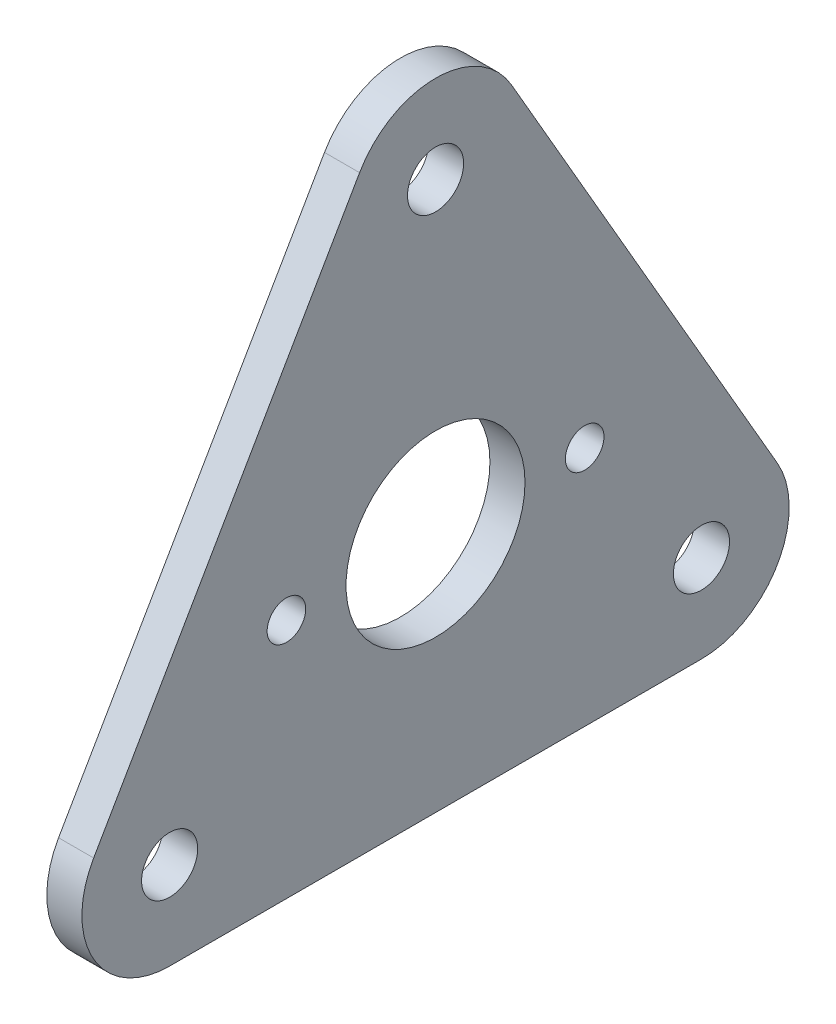
ISO-10303-21;
HEADER;
FILE_DESCRIPTION(('STEP AP214'),'2;1');
FILE_NAME('part.step','',(''),(''),'','','');
FILE_SCHEMA(('AUTOMOTIVE_DESIGN { 1 0 10303 214 1 1 1 1 }'));
ENDSEC;
DATA;
#1=APPLICATION_CONTEXT('core data for automotive mechanical design processes');
#2=APPLICATION_PROTOCOL_DEFINITION('international standard','automotive_design',2000,#1);
#3=PRODUCT_CONTEXT('',#1,'mechanical');
#4=PRODUCT('Part','Part','',(#3));
#5=PRODUCT_RELATED_PRODUCT_CATEGORY('part','',(#4));
#6=PRODUCT_DEFINITION_FORMATION('','',#4);
#7=PRODUCT_DEFINITION_CONTEXT('part definition',#1,'design');
#8=PRODUCT_DEFINITION('design','',#6,#7);
#9=PRODUCT_DEFINITION_SHAPE('','',#8);
#10=(LENGTH_UNIT() NAMED_UNIT(*) SI_UNIT(.MILLI.,.METRE.));
#11=(NAMED_UNIT(*) PLANE_ANGLE_UNIT() SI_UNIT($,.RADIAN.));
#12=(NAMED_UNIT(*) SI_UNIT($,.STERADIAN.) SOLID_ANGLE_UNIT());
#13=UNCERTAINTY_MEASURE_WITH_UNIT(LENGTH_MEASURE(1.E-05),#10,'distance_accuracy_value','');
#14=(GEOMETRIC_REPRESENTATION_CONTEXT(3) GLOBAL_UNCERTAINTY_ASSIGNED_CONTEXT((#13)) GLOBAL_UNIT_ASSIGNED_CONTEXT((#10,
#11,#12)) REPRESENTATION_CONTEXT('',''));
#15=CARTESIAN_POINT('',(0.,0.,0.));
#16=DIRECTION('',(0.,0.,1.));
#17=DIRECTION('',(1.,0.,0.));
#18=AXIS2_PLACEMENT_3D('',#15,#16,#17);
#19=CARTESIAN_POINT('',(2.,17.5,0.));
#20=DIRECTION('',(1.,0.,0.));
#21=DIRECTION('',(0.,0.,-1.));
#22=AXIS2_PLACEMENT_3D('',#19,#20,#21);
#23=PLANE('',#22);
#24=CARTESIAN_POINT('',(2.,-8.75,-15.1554445662277));
#25=DIRECTION('',(1.,0.,0.));
#26=DIRECTION('',(0.,0.,-1.));
#27=AXIS2_PLACEMENT_3D('',#24,#25,#26);
#28=CIRCLE('',#27,1.6);
#29=CARTESIAN_POINT('',(2.,-8.75,-16.7554445662277));
#30=VERTEX_POINT('',#29);
#31=EDGE_CURVE('E208',#30,#30,#28,.T.);
#32=ORIENTED_EDGE('',*,*,#31,.F.);
#33=EDGE_LOOP('',(#32));
#34=FACE_BOUND('',#33,.T.);
#35=CARTESIAN_POINT('',(2.,0.,8.5));
#36=DIRECTION('',(1.,0.,0.));
#37=DIRECTION('',(0.,0.,-1.));
#38=AXIS2_PLACEMENT_3D('',#35,#36,#37);
#39=CIRCLE('',#38,1.1);
#40=CARTESIAN_POINT('',(2.,0.,7.4));
#41=VERTEX_POINT('',#40);
#42=EDGE_CURVE('E141',#41,#41,#39,.T.);
#43=ORIENTED_EDGE('',*,*,#42,.F.);
#44=EDGE_LOOP('',(#43));
#45=FACE_BOUND('',#44,.T.);
#46=CARTESIAN_POINT('',(2.,0.,0.));
#47=DIRECTION('',(1.,0.,0.));
#48=DIRECTION('',(0.,0.,-1.));
#49=AXIS2_PLACEMENT_3D('',#46,#47,#48);
#50=CIRCLE('',#49,5.1);
#51=CARTESIAN_POINT('',(2.,0.,-5.1));
#52=VERTEX_POINT('',#51);
#53=EDGE_CURVE('E142',#52,#52,#50,.T.);
#54=ORIENTED_EDGE('',*,*,#53,.F.);
#55=EDGE_LOOP('',(#54));
#56=FACE_BOUND('',#55,.T.);
#57=CARTESIAN_POINT('',(2.,17.5,0.));
#58=DIRECTION('',(1.,0.,0.));
#59=DIRECTION('',(0.,0.,-1.));
#60=AXIS2_PLACEMENT_3D('',#57,#58,#59);
#61=CIRCLE('',#60,5.);
#62=CARTESIAN_POINT('',(2.,20.,-4.33012701892219));
#63=VERTEX_POINT('',#62);
#64=CARTESIAN_POINT('',(2.,20.,4.3301270189222));
#65=VERTEX_POINT('',#64);
#66=EDGE_CURVE('E154',#63,#65,#61,.T.);
#67=ORIENTED_EDGE('',*,*,#66,.T.);
#68=DIRECTION('',(0.,-0.866025403784439,0.5));
#69=VECTOR('',#68,1.);
#70=CARTESIAN_POINT('',(2.,20.,4.3301270189222));
#71=LINE('',#70,#69);
#72=CARTESIAN_POINT('',(2.,-6.25000000000001,19.4855715851499));
#73=VERTEX_POINT('',#72);
#74=EDGE_CURVE('E89',#65,#73,#71,.T.);
#75=ORIENTED_EDGE('',*,*,#74,.T.);
#76=CARTESIAN_POINT('',(2.,-8.75000000000001,15.1554445662277));
#77=DIRECTION('',(1.,0.,0.));
#78=DIRECTION('',(0.,0.,-1.));
#79=AXIS2_PLACEMENT_3D('',#76,#77,#78);
#80=CIRCLE('',#79,5.00000000000001);
#81=CARTESIAN_POINT('',(2.,-13.75,15.1554445662277));
#82=VERTEX_POINT('',#81);
#83=EDGE_CURVE('E102',#73,#82,#80,.T.);
#84=ORIENTED_EDGE('',*,*,#83,.T.);
#85=DIRECTION('',(0.,0.,-1.));
#86=VECTOR('',#85,1.);
#87=CARTESIAN_POINT('',(2.,-13.75,15.1554445662277));
#88=LINE('',#87,#86);
#89=CARTESIAN_POINT('',(2.,-13.75,-15.1554445662277));
#90=VERTEX_POINT('',#89);
#91=EDGE_CURVE('E96',#82,#90,#88,.T.);
#92=ORIENTED_EDGE('',*,*,#91,.T.);
#93=CARTESIAN_POINT('',(2.,-8.75,-15.1554445662277));
#94=DIRECTION('',(1.,0.,0.));
#95=DIRECTION('',(0.,0.,-1.));
#96=AXIS2_PLACEMENT_3D('',#93,#94,#95);
#97=CIRCLE('',#96,5.);
#98=CARTESIAN_POINT('',(2.,-6.25000000000001,-19.4855715851499));
#99=VERTEX_POINT('',#98);
#100=EDGE_CURVE('E100',#90,#99,#97,.T.);
#101=ORIENTED_EDGE('',*,*,#100,.T.);
#102=DIRECTION('',(0.,0.866025403784438,0.5));
#103=VECTOR('',#102,1.);
#104=CARTESIAN_POINT('',(2.,-6.25000000000001,-19.4855715851499));
#105=LINE('',#104,#103);
#106=EDGE_CURVE('E52',#99,#63,#105,.T.);
#107=ORIENTED_EDGE('',*,*,#106,.T.);
#108=EDGE_LOOP('',(#67,#75,#84,#92,#101,#107));
#109=FACE_BOUND('',#108,.T.);
#110=CARTESIAN_POINT('',(2.,17.5,0.));
#111=DIRECTION('',(1.,0.,0.));
#112=DIRECTION('',(0.,0.,-1.));
#113=AXIS2_PLACEMENT_3D('',#110,#111,#112);
#114=CIRCLE('',#113,1.6);
#115=CARTESIAN_POINT('',(2.,17.5,-1.6));
#116=VERTEX_POINT('',#115);
#117=EDGE_CURVE('E130',#116,#116,#114,.T.);
#118=ORIENTED_EDGE('',*,*,#117,.F.);
#119=EDGE_LOOP('',(#118));
#120=FACE_BOUND('',#119,.T.);
#121=CARTESIAN_POINT('',(2.,0.,-8.5));
#122=DIRECTION('',(1.,0.,0.));
#123=DIRECTION('',(0.,0.,1.));
#124=AXIS2_PLACEMENT_3D('',#121,#122,#123);
#125=CIRCLE('',#124,1.1);
#126=CARTESIAN_POINT('',(2.,0.,-7.4));
#127=VERTEX_POINT('',#126);
#128=EDGE_CURVE('E212',#127,#127,#125,.T.);
#129=ORIENTED_EDGE('',*,*,#128,.F.);
#130=EDGE_LOOP('',(#129));
#131=FACE_BOUND('',#130,.T.);
#132=CARTESIAN_POINT('',(2.,-8.75000000000001,15.1554445662277));
#133=DIRECTION('',(1.,0.,0.));
#134=DIRECTION('',(0.,0.,-1.));
#135=AXIS2_PLACEMENT_3D('',#132,#133,#134);
#136=CIRCLE('',#135,1.6);
#137=CARTESIAN_POINT('',(2.,-8.75000000000001,13.5554445662277));
#138=VERTEX_POINT('',#137);
#139=EDGE_CURVE('E203',#138,#138,#136,.T.);
#140=ORIENTED_EDGE('',*,*,#139,.F.);
#141=EDGE_LOOP('',(#140));
#142=FACE_BOUND('',#141,.T.);
#143=ADVANCED_FACE('F35',(#34,#45,#56,#109,#120,#131,#142),#23,.T.);
#144=CARTESIAN_POINT('',(0.,17.5,0.));
#145=DIRECTION('',(1.,0.,0.));
#146=DIRECTION('',(0.,0.,-1.));
#147=AXIS2_PLACEMENT_3D('',#144,#145,#146);
#148=PLANE('',#147);
#149=CARTESIAN_POINT('',(0.,17.5,0.));
#150=DIRECTION('',(1.,0.,0.));
#151=DIRECTION('',(0.,0.,-1.));
#152=AXIS2_PLACEMENT_3D('',#149,#150,#151);
#153=CIRCLE('',#152,5.);
#154=CARTESIAN_POINT('',(0.,20.,-4.33012701892219));
#155=VERTEX_POINT('',#154);
#156=CARTESIAN_POINT('',(0.,20.,4.3301270189222));
#157=VERTEX_POINT('',#156);
#158=EDGE_CURVE('E146',#155,#157,#153,.T.);
#159=ORIENTED_EDGE('',*,*,#158,.F.);
#160=DIRECTION('',(0.,0.866025403784438,0.5));
#161=VECTOR('',#160,1.);
#162=CARTESIAN_POINT('',(0.,-6.25000000000001,-19.4855715851499));
#163=LINE('',#162,#161);
#164=CARTESIAN_POINT('',(0.,-6.25000000000001,-19.4855715851499));
#165=VERTEX_POINT('',#164);
#166=EDGE_CURVE('E81',#165,#155,#163,.T.);
#167=ORIENTED_EDGE('',*,*,#166,.F.);
#168=CARTESIAN_POINT('',(0.,-8.75,-15.1554445662277));
#169=DIRECTION('',(1.,0.,0.));
#170=DIRECTION('',(0.,0.,-1.));
#171=AXIS2_PLACEMENT_3D('',#168,#169,#170);
#172=CIRCLE('',#171,5.);
#173=CARTESIAN_POINT('',(0.,-13.75,-15.1554445662277));
#174=VERTEX_POINT('',#173);
#175=EDGE_CURVE('E75',#174,#165,#172,.T.);
#176=ORIENTED_EDGE('',*,*,#175,.F.);
#177=DIRECTION('',(0.,0.,-1.));
#178=VECTOR('',#177,1.);
#179=CARTESIAN_POINT('',(0.,-13.75,15.1554445662277));
#180=LINE('',#179,#178);
#181=CARTESIAN_POINT('',(0.,-13.75,15.1554445662277));
#182=VERTEX_POINT('',#181);
#183=EDGE_CURVE('E110',#182,#174,#180,.T.);
#184=ORIENTED_EDGE('',*,*,#183,.F.);
#185=CARTESIAN_POINT('',(0.,-8.75000000000001,15.1554445662277));
#186=DIRECTION('',(1.,0.,0.));
#187=DIRECTION('',(0.,0.,-1.));
#188=AXIS2_PLACEMENT_3D('',#185,#186,#187);
#189=CIRCLE('',#188,5.00000000000001);
#190=CARTESIAN_POINT('',(0.,-6.25000000000001,19.4855715851499));
#191=VERTEX_POINT('',#190);
#192=EDGE_CURVE('E166',#191,#182,#189,.T.);
#193=ORIENTED_EDGE('',*,*,#192,.F.);
#194=DIRECTION('',(0.,-0.866025403784439,0.5));
#195=VECTOR('',#194,1.);
#196=CARTESIAN_POINT('',(0.,20.,4.3301270189222));
#197=LINE('',#196,#195);
#198=EDGE_CURVE('E162',#157,#191,#197,.T.);
#199=ORIENTED_EDGE('',*,*,#198,.F.);
#200=EDGE_LOOP('',(#159,#167,#176,#184,#193,#199));
#201=FACE_BOUND('',#200,.T.);
#202=CARTESIAN_POINT('',(0.,0.,0.));
#203=DIRECTION('',(1.,0.,0.));
#204=DIRECTION('',(0.,0.,-1.));
#205=AXIS2_PLACEMENT_3D('',#202,#203,#204);
#206=CIRCLE('',#205,5.1);
#207=CARTESIAN_POINT('',(0.,0.,-5.1));
#208=VERTEX_POINT('',#207);
#209=EDGE_CURVE('E135',#208,#208,#206,.T.);
#210=ORIENTED_EDGE('',*,*,#209,.T.);
#211=EDGE_LOOP('',(#210));
#212=FACE_BOUND('',#211,.T.);
#213=CARTESIAN_POINT('',(0.,17.5,0.));
#214=DIRECTION('',(1.,0.,0.));
#215=DIRECTION('',(0.,0.,-1.));
#216=AXIS2_PLACEMENT_3D('',#213,#214,#215);
#217=CIRCLE('',#216,1.6);
#218=CARTESIAN_POINT('',(0.,17.5,-1.6));
#219=VERTEX_POINT('',#218);
#220=EDGE_CURVE('E136',#219,#219,#217,.T.);
#221=ORIENTED_EDGE('',*,*,#220,.T.);
#222=EDGE_LOOP('',(#221));
#223=FACE_BOUND('',#222,.T.);
#224=CARTESIAN_POINT('',(0.,0.,8.5));
#225=DIRECTION('',(1.,0.,0.));
#226=DIRECTION('',(0.,0.,-1.));
#227=AXIS2_PLACEMENT_3D('',#224,#225,#226);
#228=CIRCLE('',#227,1.1);
#229=CARTESIAN_POINT('',(0.,0.,7.4));
#230=VERTEX_POINT('',#229);
#231=EDGE_CURVE('E137',#230,#230,#228,.T.);
#232=ORIENTED_EDGE('',*,*,#231,.T.);
#233=EDGE_LOOP('',(#232));
#234=FACE_BOUND('',#233,.T.);
#235=CARTESIAN_POINT('',(0.,0.,-8.5));
#236=DIRECTION('',(1.,0.,0.));
#237=DIRECTION('',(0.,0.,1.));
#238=AXIS2_PLACEMENT_3D('',#235,#236,#237);
#239=CIRCLE('',#238,1.1);
#240=CARTESIAN_POINT('',(0.,0.,-7.4));
#241=VERTEX_POINT('',#240);
#242=EDGE_CURVE('E194',#241,#241,#239,.T.);
#243=ORIENTED_EDGE('',*,*,#242,.T.);
#244=EDGE_LOOP('',(#243));
#245=FACE_BOUND('',#244,.T.);
#246=CARTESIAN_POINT('',(0.,-8.75,-15.1554445662277));
#247=DIRECTION('',(1.,0.,0.));
#248=DIRECTION('',(0.,0.,-1.));
#249=AXIS2_PLACEMENT_3D('',#246,#247,#248);
#250=CIRCLE('',#249,1.6);
#251=CARTESIAN_POINT('',(0.,-8.75,-16.7554445662277));
#252=VERTEX_POINT('',#251);
#253=EDGE_CURVE('E198',#252,#252,#250,.T.);
#254=ORIENTED_EDGE('',*,*,#253,.T.);
#255=EDGE_LOOP('',(#254));
#256=FACE_BOUND('',#255,.T.);
#257=CARTESIAN_POINT('',(0.,-8.75000000000001,15.1554445662277));
#258=DIRECTION('',(1.,0.,0.));
#259=DIRECTION('',(0.,0.,-1.));
#260=AXIS2_PLACEMENT_3D('',#257,#258,#259);
#261=CIRCLE('',#260,1.6);
#262=CARTESIAN_POINT('',(0.,-8.75000000000001,13.5554445662277));
#263=VERTEX_POINT('',#262);
#264=EDGE_CURVE('E201',#263,#263,#261,.T.);
#265=ORIENTED_EDGE('',*,*,#264,.T.);
#266=EDGE_LOOP('',(#265));
#267=FACE_BOUND('',#266,.T.);
#268=ADVANCED_FACE('F179',(#201,#212,#223,#234,#245,#256,#267),#148,.F.);
#269=CARTESIAN_POINT('',(2.,17.5,0.));
#270=DIRECTION('',(-1.,0.,0.));
#271=DIRECTION('',(0.,0.,1.));
#272=AXIS2_PLACEMENT_3D('',#269,#270,#271);
#273=CYLINDRICAL_SURFACE('',#272,5.);
#274=ORIENTED_EDGE('',*,*,#158,.T.);
#275=DIRECTION('',(-1.,0.,0.));
#276=VECTOR('',#275,1.);
#277=CARTESIAN_POINT('',(2.,20.,4.3301270189222));
#278=LINE('',#277,#276);
#279=EDGE_CURVE('E12',#65,#157,#278,.T.);
#280=ORIENTED_EDGE('',*,*,#279,.F.);
#281=ORIENTED_EDGE('',*,*,#66,.F.);
#282=DIRECTION('',(-1.,0.,0.));
#283=VECTOR('',#282,1.);
#284=CARTESIAN_POINT('',(2.,20.,-4.33012701892219));
#285=LINE('',#284,#283);
#286=EDGE_CURVE('E116',#63,#155,#285,.T.);
#287=ORIENTED_EDGE('',*,*,#286,.T.);
#288=EDGE_LOOP('',(#274,#280,#281,#287));
#289=FACE_BOUND('',#288,.T.);
#290=ADVANCED_FACE('F37',(#289),#273,.T.);
#291=CARTESIAN_POINT('',(2.,20.,4.3301270189222));
#292=DIRECTION('',(0.,-0.5,-0.866025403784439));
#293=DIRECTION('',(0.,0.866025403784439,-0.5));
#294=AXIS2_PLACEMENT_3D('',#291,#292,#293);
#295=PLANE('',#294);
#296=ORIENTED_EDGE('',*,*,#198,.T.);
#297=DIRECTION('',(-1.,0.,0.));
#298=VECTOR('',#297,1.);
#299=CARTESIAN_POINT('',(2.,-6.25000000000001,19.4855715851499));
#300=LINE('',#299,#298);
#301=EDGE_CURVE('E44',#73,#191,#300,.T.);
#302=ORIENTED_EDGE('',*,*,#301,.F.);
#303=ORIENTED_EDGE('',*,*,#74,.F.);
#304=ORIENTED_EDGE('',*,*,#279,.T.);
#305=EDGE_LOOP('',(#296,#302,#303,#304));
#306=FACE_BOUND('',#305,.T.);
#307=ADVANCED_FACE('F161',(#306),#295,.F.);
#308=CARTESIAN_POINT('',(2.,-8.75000000000001,15.1554445662277));
#309=DIRECTION('',(-1.,0.,0.));
#310=DIRECTION('',(0.,0.,1.));
#311=AXIS2_PLACEMENT_3D('',#308,#309,#310);
#312=CYLINDRICAL_SURFACE('',#311,5.00000000000001);
#313=ORIENTED_EDGE('',*,*,#192,.T.);
#314=DIRECTION('',(-1.,0.,0.));
#315=VECTOR('',#314,1.);
#316=CARTESIAN_POINT('',(2.,-13.75,15.1554445662277));
#317=LINE('',#316,#315);
#318=EDGE_CURVE('E111',#82,#182,#317,.T.);
#319=ORIENTED_EDGE('',*,*,#318,.F.);
#320=ORIENTED_EDGE('',*,*,#83,.F.);
#321=ORIENTED_EDGE('',*,*,#301,.T.);
#322=EDGE_LOOP('',(#313,#319,#320,#321));
#323=FACE_BOUND('',#322,.T.);
#324=ADVANCED_FACE('F165',(#323),#312,.T.);
#325=CARTESIAN_POINT('',(2.,-13.75,15.1554445662277));
#326=DIRECTION('',(0.,1.,0.));
#327=DIRECTION('',(0.,0.,1.));
#328=AXIS2_PLACEMENT_3D('',#325,#326,#327);
#329=PLANE('',#328);
#330=ORIENTED_EDGE('',*,*,#183,.T.);
#331=DIRECTION('',(-1.,0.,0.));
#332=VECTOR('',#331,1.);
#333=CARTESIAN_POINT('',(2.,-13.75,-15.1554445662277));
#334=LINE('',#333,#332);
#335=EDGE_CURVE('E107',#90,#174,#334,.T.);
#336=ORIENTED_EDGE('',*,*,#335,.F.);
#337=ORIENTED_EDGE('',*,*,#91,.F.);
#338=ORIENTED_EDGE('',*,*,#318,.T.);
#339=EDGE_LOOP('',(#330,#336,#337,#338));
#340=FACE_BOUND('',#339,.T.);
#341=ADVANCED_FACE('F108',(#340),#329,.F.);
#342=CARTESIAN_POINT('',(2.,-8.75,-15.1554445662277));
#343=DIRECTION('',(-1.,0.,0.));
#344=DIRECTION('',(0.,0.,1.));
#345=AXIS2_PLACEMENT_3D('',#342,#343,#344);
#346=CYLINDRICAL_SURFACE('',#345,5.);
#347=ORIENTED_EDGE('',*,*,#175,.T.);
#348=DIRECTION('',(-1.,0.,0.));
#349=VECTOR('',#348,1.);
#350=CARTESIAN_POINT('',(2.,-6.25000000000001,-19.4855715851499));
#351=LINE('',#350,#349);
#352=EDGE_CURVE('E112',#99,#165,#351,.T.);
#353=ORIENTED_EDGE('',*,*,#352,.F.);
#354=ORIENTED_EDGE('',*,*,#100,.F.);
#355=ORIENTED_EDGE('',*,*,#335,.T.);
#356=EDGE_LOOP('',(#347,#353,#354,#355));
#357=FACE_BOUND('',#356,.T.);
#358=ADVANCED_FACE('F114',(#357),#346,.T.);
#359=CARTESIAN_POINT('',(2.,-6.25000000000001,-19.4855715851499));
#360=DIRECTION('',(0.,-0.5,0.866025403784438));
#361=DIRECTION('',(0.,-0.866025403784438,-0.5));
#362=AXIS2_PLACEMENT_3D('',#359,#360,#361);
#363=PLANE('',#362);
#364=ORIENTED_EDGE('',*,*,#166,.T.);
#365=ORIENTED_EDGE('',*,*,#286,.F.);
#366=ORIENTED_EDGE('',*,*,#106,.F.);
#367=ORIENTED_EDGE('',*,*,#352,.T.);
#368=EDGE_LOOP('',(#364,#365,#366,#367));
#369=FACE_BOUND('',#368,.T.);
#370=ADVANCED_FACE('F233',(#369),#363,.F.);
#371=CARTESIAN_POINT('',(2.,0.,0.));
#372=DIRECTION('',(-1.,0.,0.));
#373=DIRECTION('',(0.,0.,1.));
#374=AXIS2_PLACEMENT_3D('',#371,#372,#373);
#375=CYLINDRICAL_SURFACE('',#374,5.1);
#376=ORIENTED_EDGE('',*,*,#53,.T.);
#377=EDGE_LOOP('',(#376));
#378=FACE_BOUND('',#377,.T.);
#379=ORIENTED_EDGE('',*,*,#209,.F.);
#380=EDGE_LOOP('',(#379));
#381=FACE_BOUND('',#380,.T.);
#382=ADVANCED_FACE('F229',(#378,#381),#375,.F.);
#383=CARTESIAN_POINT('',(2.,17.5,0.));
#384=DIRECTION('',(-1.,0.,0.));
#385=DIRECTION('',(0.,0.,1.));
#386=AXIS2_PLACEMENT_3D('',#383,#384,#385);
#387=CYLINDRICAL_SURFACE('',#386,1.6);
#388=ORIENTED_EDGE('',*,*,#117,.T.);
#389=EDGE_LOOP('',(#388));
#390=FACE_BOUND('',#389,.T.);
#391=ORIENTED_EDGE('',*,*,#220,.F.);
#392=EDGE_LOOP('',(#391));
#393=FACE_BOUND('',#392,.T.);
#394=ADVANCED_FACE('F232',(#390,#393),#387,.F.);
#395=CARTESIAN_POINT('',(2.,0.,8.5));
#396=DIRECTION('',(-1.,0.,0.));
#397=DIRECTION('',(0.,0.,1.));
#398=AXIS2_PLACEMENT_3D('',#395,#396,#397);
#399=CYLINDRICAL_SURFACE('',#398,1.1);
#400=ORIENTED_EDGE('',*,*,#42,.T.);
#401=EDGE_LOOP('',(#400));
#402=FACE_BOUND('',#401,.T.);
#403=ORIENTED_EDGE('',*,*,#231,.F.);
#404=EDGE_LOOP('',(#403));
#405=FACE_BOUND('',#404,.T.);
#406=ADVANCED_FACE('F220',(#402,#405),#399,.F.);
#407=CARTESIAN_POINT('',(2.,0.,-8.5));
#408=DIRECTION('',(-1.,0.,0.));
#409=DIRECTION('',(0.,0.,1.));
#410=AXIS2_PLACEMENT_3D('',#407,#408,#409);
#411=CYLINDRICAL_SURFACE('',#410,1.1);
#412=ORIENTED_EDGE('',*,*,#128,.T.);
#413=EDGE_LOOP('',(#412));
#414=FACE_BOUND('',#413,.T.);
#415=ORIENTED_EDGE('',*,*,#242,.F.);
#416=EDGE_LOOP('',(#415));
#417=FACE_BOUND('',#416,.T.);
#418=ADVANCED_FACE('F310',(#414,#417),#411,.F.);
#419=CARTESIAN_POINT('',(2.,-8.75,-15.1554445662277));
#420=DIRECTION('',(-1.,0.,0.));
#421=DIRECTION('',(0.,0.,1.));
#422=AXIS2_PLACEMENT_3D('',#419,#420,#421);
#423=CYLINDRICAL_SURFACE('',#422,1.6);
#424=ORIENTED_EDGE('',*,*,#31,.T.);
#425=EDGE_LOOP('',(#424));
#426=FACE_BOUND('',#425,.T.);
#427=ORIENTED_EDGE('',*,*,#253,.F.);
#428=EDGE_LOOP('',(#427));
#429=FACE_BOUND('',#428,.T.);
#430=ADVANCED_FACE('F317',(#426,#429),#423,.F.);
#431=CARTESIAN_POINT('',(2.,-8.75000000000001,15.1554445662277));
#432=DIRECTION('',(-1.,0.,0.));
#433=DIRECTION('',(0.,0.,1.));
#434=AXIS2_PLACEMENT_3D('',#431,#432,#433);
#435=CYLINDRICAL_SURFACE('',#434,1.6);
#436=ORIENTED_EDGE('',*,*,#264,.F.);
#437=EDGE_LOOP('',(#436));
#438=FACE_BOUND('',#437,.T.);
#439=ORIENTED_EDGE('',*,*,#139,.T.);
#440=EDGE_LOOP('',(#439));
#441=FACE_BOUND('',#440,.T.);
#442=ADVANCED_FACE('F326',(#438,#441),#435,.F.);
#443=CLOSED_SHELL('',(#143,#268,#290,#307,#324,#341,#358,#370,#382,#394,#406,#418,#430,#442));
#444=MANIFOLD_SOLID_BREP('B2',#443);
#445=ADVANCED_BREP_SHAPE_REPRESENTATION('',(#18,#444),#14);
#446=SHAPE_DEFINITION_REPRESENTATION(#9,#445);
ENDSEC;
END-ISO-10303-21;
